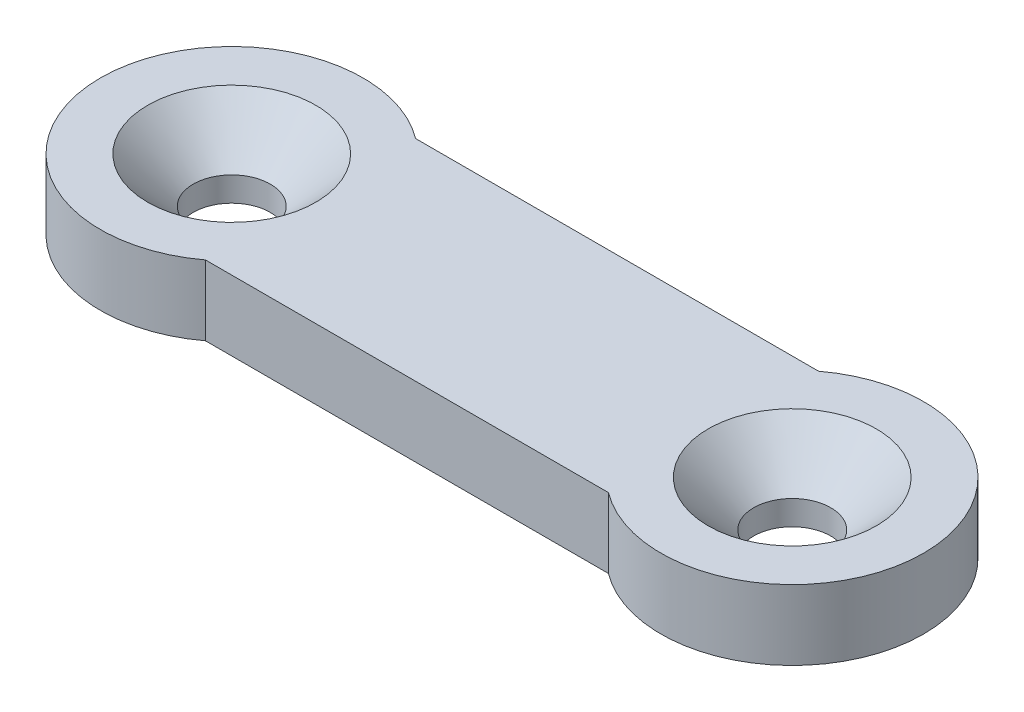
ISO-10303-21;
HEADER;
FILE_DESCRIPTION(('STEP AP214'),'2;1');
FILE_NAME('part.step','',(''),(''),'','','');
FILE_SCHEMA(('AUTOMOTIVE_DESIGN { 1 0 10303 214 1 1 1 1 }'));
ENDSEC;
DATA;
#1=APPLICATION_CONTEXT('core data for automotive mechanical design processes');
#2=APPLICATION_PROTOCOL_DEFINITION('international standard','automotive_design',2000,#1);
#3=PRODUCT_CONTEXT('',#1,'mechanical');
#4=PRODUCT('Part','Part','',(#3));
#5=PRODUCT_RELATED_PRODUCT_CATEGORY('part','',(#4));
#6=PRODUCT_DEFINITION_FORMATION('','',#4);
#7=PRODUCT_DEFINITION_CONTEXT('part definition',#1,'design');
#8=PRODUCT_DEFINITION('design','',#6,#7);
#9=PRODUCT_DEFINITION_SHAPE('','',#8);
#10=(LENGTH_UNIT() NAMED_UNIT(*) SI_UNIT(.MILLI.,.METRE.));
#11=(NAMED_UNIT(*) PLANE_ANGLE_UNIT() SI_UNIT($,.RADIAN.));
#12=(NAMED_UNIT(*) SI_UNIT($,.STERADIAN.) SOLID_ANGLE_UNIT());
#13=UNCERTAINTY_MEASURE_WITH_UNIT(LENGTH_MEASURE(1.E-05),#10,'distance_accuracy_value','');
#14=(GEOMETRIC_REPRESENTATION_CONTEXT(3) GLOBAL_UNCERTAINTY_ASSIGNED_CONTEXT((#13)) GLOBAL_UNIT_ASSIGNED_CONTEXT((#10,
#11,#12)) REPRESENTATION_CONTEXT('',''));
#15=CARTESIAN_POINT('',(0.,0.,0.));
#16=DIRECTION('',(0.,0.,1.));
#17=DIRECTION('',(1.,0.,0.));
#18=AXIS2_PLACEMENT_3D('',#15,#16,#17);
#19=CARTESIAN_POINT('',(-8.,2.,0.));
#20=DIRECTION('',(0.,1.,0.));
#21=DIRECTION('',(0.,0.,1.));
#22=AXIS2_PLACEMENT_3D('',#19,#20,#21);
#23=PLANE('',#22);
#24=CARTESIAN_POINT('',(8.,2.,0.));
#25=DIRECTION('',(0.,1.,0.));
#26=DIRECTION('',(0.,0.,1.));
#27=AXIS2_PLACEMENT_3D('',#24,#25,#26);
#28=CIRCLE('',#27,2.40000000000001);
#29=CARTESIAN_POINT('',(8.,2.,2.4));
#30=VERTEX_POINT('',#29);
#31=EDGE_CURVE('E45',#30,#30,#28,.F.);
#32=ORIENTED_EDGE('',*,*,#31,.T.);
#33=EDGE_LOOP('',(#32));
#34=FACE_BOUND('',#33,.T.);
#35=CARTESIAN_POINT('',(-8.,2.,0.));
#36=DIRECTION('',(0.,1.,0.));
#37=DIRECTION('',(0.,0.,1.));
#38=AXIS2_PLACEMENT_3D('',#35,#36,#37);
#39=CIRCLE('',#38,2.40000000000001);
#40=CARTESIAN_POINT('',(-8.,2.,2.40000000000001));
#41=VERTEX_POINT('',#40);
#42=EDGE_CURVE('E123',#41,#41,#39,.F.);
#43=ORIENTED_EDGE('',*,*,#42,.T.);
#44=EDGE_LOOP('',(#43));
#45=FACE_BOUND('',#44,.T.);
#46=DIRECTION('',(1.,0.,0.));
#47=VECTOR('',#46,1.);
#48=CARTESIAN_POINT('',(-8.,2.,3.));
#49=LINE('',#48,#47);
#50=CARTESIAN_POINT('',(-5.75,2.,3.));
#51=VERTEX_POINT('',#50);
#52=CARTESIAN_POINT('',(5.75,2.,3.));
#53=VERTEX_POINT('',#52);
#54=EDGE_CURVE('E87',#51,#53,#49,.T.);
#55=ORIENTED_EDGE('',*,*,#54,.T.);
#56=CARTESIAN_POINT('',(8.,2.,0.));
#57=DIRECTION('',(0.,1.,0.));
#58=DIRECTION('',(0.,0.,1.));
#59=AXIS2_PLACEMENT_3D('',#56,#57,#58);
#60=CIRCLE('',#59,3.75);
#61=CARTESIAN_POINT('',(5.75,2.,-3.));
#62=VERTEX_POINT('',#61);
#63=EDGE_CURVE('E100',#53,#62,#60,.T.);
#64=ORIENTED_EDGE('',*,*,#63,.T.);
#65=DIRECTION('',(-1.,0.,0.));
#66=VECTOR('',#65,1.);
#67=CARTESIAN_POINT('',(-8.,2.,-3.));
#68=LINE('',#67,#66);
#69=CARTESIAN_POINT('',(-5.75,2.,-3.));
#70=VERTEX_POINT('',#69);
#71=EDGE_CURVE('E92',#62,#70,#68,.T.);
#72=ORIENTED_EDGE('',*,*,#71,.T.);
#73=CARTESIAN_POINT('',(-8.,2.,0.));
#74=DIRECTION('',(0.,1.,0.));
#75=DIRECTION('',(0.,0.,1.));
#76=AXIS2_PLACEMENT_3D('',#73,#74,#75);
#77=CIRCLE('',#76,3.75);
#78=EDGE_CURVE('E102',#70,#51,#77,.T.);
#79=ORIENTED_EDGE('',*,*,#78,.T.);
#80=EDGE_LOOP('',(#55,#64,#72,#79));
#81=FACE_BOUND('',#80,.T.);
#82=ADVANCED_FACE('F36',(#34,#45,#81),#23,.T.);
#83=CARTESIAN_POINT('',(-8.,0.,0.));
#84=DIRECTION('',(0.,1.,0.));
#85=DIRECTION('',(0.,0.,1.));
#86=AXIS2_PLACEMENT_3D('',#83,#84,#85);
#87=PLANE('',#86);
#88=DIRECTION('',(-1.,0.,0.));
#89=VECTOR('',#88,1.);
#90=CARTESIAN_POINT('',(-8.,0.,-3.));
#91=LINE('',#90,#89);
#92=CARTESIAN_POINT('',(5.75,0.,-3.));
#93=VERTEX_POINT('',#92);
#94=CARTESIAN_POINT('',(-5.75,0.,-3.));
#95=VERTEX_POINT('',#94);
#96=EDGE_CURVE('E76',#93,#95,#91,.T.);
#97=ORIENTED_EDGE('',*,*,#96,.F.);
#98=CARTESIAN_POINT('',(8.,0.,0.));
#99=DIRECTION('',(0.,1.,0.));
#100=DIRECTION('',(0.,0.,1.));
#101=AXIS2_PLACEMENT_3D('',#98,#99,#100);
#102=CIRCLE('',#101,3.75);
#103=CARTESIAN_POINT('',(5.75,0.,3.));
#104=VERTEX_POINT('',#103);
#105=EDGE_CURVE('E81',#93,#104,#102,.F.);
#106=ORIENTED_EDGE('',*,*,#105,.T.);
#107=DIRECTION('',(1.,0.,0.));
#108=VECTOR('',#107,1.);
#109=CARTESIAN_POINT('',(-8.,0.,3.));
#110=LINE('',#109,#108);
#111=CARTESIAN_POINT('',(-5.75,0.,3.));
#112=VERTEX_POINT('',#111);
#113=EDGE_CURVE('E52',#112,#104,#110,.T.);
#114=ORIENTED_EDGE('',*,*,#113,.F.);
#115=CARTESIAN_POINT('',(-8.,0.,0.));
#116=DIRECTION('',(0.,1.,0.));
#117=DIRECTION('',(0.,0.,1.));
#118=AXIS2_PLACEMENT_3D('',#115,#116,#117);
#119=CIRCLE('',#118,3.75);
#120=EDGE_CURVE('E83',#112,#95,#119,.F.);
#121=ORIENTED_EDGE('',*,*,#120,.T.);
#122=EDGE_LOOP('',(#97,#106,#114,#121));
#123=FACE_BOUND('',#122,.T.);
#124=CARTESIAN_POINT('',(-8.,0.,0.));
#125=DIRECTION('',(0.,1.,0.));
#126=DIRECTION('',(0.,0.,1.));
#127=AXIS2_PLACEMENT_3D('',#124,#125,#126);
#128=CIRCLE('',#127,1.1);
#129=CARTESIAN_POINT('',(-8.,0.,1.1));
#130=VERTEX_POINT('',#129);
#131=EDGE_CURVE('E114',#130,#130,#128,.T.);
#132=ORIENTED_EDGE('',*,*,#131,.T.);
#133=EDGE_LOOP('',(#132));
#134=FACE_BOUND('',#133,.T.);
#135=CARTESIAN_POINT('',(8.,0.,0.));
#136=DIRECTION('',(0.,1.,0.));
#137=DIRECTION('',(0.,0.,1.));
#138=AXIS2_PLACEMENT_3D('',#135,#136,#137);
#139=CIRCLE('',#138,1.1);
#140=CARTESIAN_POINT('',(8.,0.,1.1));
#141=VERTEX_POINT('',#140);
#142=EDGE_CURVE('E111',#141,#141,#139,.T.);
#143=ORIENTED_EDGE('',*,*,#142,.T.);
#144=EDGE_LOOP('',(#143));
#145=FACE_BOUND('',#144,.T.);
#146=ADVANCED_FACE('F78',(#123,#134,#145),#87,.F.);
#147=CARTESIAN_POINT('',(-8.,2.,3.));
#148=DIRECTION('',(0.,0.,-1.));
#149=DIRECTION('',(-1.,0.,0.));
#150=AXIS2_PLACEMENT_3D('',#147,#148,#149);
#151=PLANE('',#150);
#152=ORIENTED_EDGE('',*,*,#113,.T.);
#153=DIRECTION('',(0.,1.,0.));
#154=VECTOR('',#153,1.);
#155=CARTESIAN_POINT('',(5.75,-10.6066017177982,3.));
#156=LINE('',#155,#154);
#157=EDGE_CURVE('E56',#104,#53,#156,.T.);
#158=ORIENTED_EDGE('',*,*,#157,.T.);
#159=ORIENTED_EDGE('',*,*,#54,.F.);
#160=DIRECTION('',(0.,1.,0.));
#161=VECTOR('',#160,1.);
#162=CARTESIAN_POINT('',(-5.75,-10.6066017177982,3.));
#163=LINE('',#162,#161);
#164=EDGE_CURVE('E107',#51,#112,#163,.F.);
#165=ORIENTED_EDGE('',*,*,#164,.T.);
#166=EDGE_LOOP('',(#152,#158,#159,#165));
#167=FACE_BOUND('',#166,.T.);
#168=ADVANCED_FACE('F144',(#167),#151,.F.);
#169=CARTESIAN_POINT('',(-8.,2.,-3.));
#170=DIRECTION('',(0.,0.,1.));
#171=DIRECTION('',(1.,0.,0.));
#172=AXIS2_PLACEMENT_3D('',#169,#170,#171);
#173=PLANE('',#172);
#174=ORIENTED_EDGE('',*,*,#71,.F.);
#175=DIRECTION('',(0.,1.,0.));
#176=VECTOR('',#175,1.);
#177=CARTESIAN_POINT('',(5.75,-10.6066017177982,-3.));
#178=LINE('',#177,#176);
#179=EDGE_CURVE('E90',#62,#93,#178,.F.);
#180=ORIENTED_EDGE('',*,*,#179,.T.);
#181=ORIENTED_EDGE('',*,*,#96,.T.);
#182=DIRECTION('',(0.,1.,0.));
#183=VECTOR('',#182,1.);
#184=CARTESIAN_POINT('',(-5.75,-10.6066017177982,-3.));
#185=LINE('',#184,#183);
#186=EDGE_CURVE('E97',#95,#70,#185,.T.);
#187=ORIENTED_EDGE('',*,*,#186,.T.);
#188=EDGE_LOOP('',(#174,#180,#181,#187));
#189=FACE_BOUND('',#188,.T.);
#190=ADVANCED_FACE('F91',(#189),#173,.F.);
#191=CARTESIAN_POINT('',(-8.,2.,0.));
#192=DIRECTION('',(0.,-1.,0.));
#193=DIRECTION('',(0.,0.,-1.));
#194=AXIS2_PLACEMENT_3D('',#191,#192,#193);
#195=CYLINDRICAL_SURFACE('',#194,1.1);
#196=CARTESIAN_POINT('',(-8.,0.699999999999998,0.));
#197=DIRECTION('',(0.,1.,0.));
#198=DIRECTION('',(0.,0.,1.));
#199=AXIS2_PLACEMENT_3D('',#196,#197,#198);
#200=CIRCLE('',#199,1.1);
#201=CARTESIAN_POINT('',(-8.,0.699999999999998,1.1));
#202=VERTEX_POINT('',#201);
#203=EDGE_CURVE('E11',#202,#202,#200,.T.);
#204=ORIENTED_EDGE('',*,*,#203,.T.);
#205=EDGE_LOOP('',(#204));
#206=FACE_BOUND('',#205,.T.);
#207=ORIENTED_EDGE('',*,*,#131,.F.);
#208=EDGE_LOOP('',(#207));
#209=FACE_BOUND('',#208,.T.);
#210=ADVANCED_FACE('F139',(#206,#209),#195,.F.);
#211=CARTESIAN_POINT('',(8.,2.,0.));
#212=DIRECTION('',(0.,-1.,0.));
#213=DIRECTION('',(0.,0.,-1.));
#214=AXIS2_PLACEMENT_3D('',#211,#212,#213);
#215=CYLINDRICAL_SURFACE('',#214,1.1);
#216=CARTESIAN_POINT('',(8.,0.699999999999998,0.));
#217=DIRECTION('',(0.,1.,0.));
#218=DIRECTION('',(0.,0.,1.));
#219=AXIS2_PLACEMENT_3D('',#216,#217,#218);
#220=CIRCLE('',#219,1.1);
#221=CARTESIAN_POINT('',(8.,0.699999999999998,1.1));
#222=VERTEX_POINT('',#221);
#223=EDGE_CURVE('E96',#222,#222,#220,.T.);
#224=ORIENTED_EDGE('',*,*,#223,.T.);
#225=EDGE_LOOP('',(#224));
#226=FACE_BOUND('',#225,.T.);
#227=ORIENTED_EDGE('',*,*,#142,.F.);
#228=EDGE_LOOP('',(#227));
#229=FACE_BOUND('',#228,.T.);
#230=ADVANCED_FACE('F135',(#226,#229),#215,.F.);
#231=CARTESIAN_POINT('',(-8.,-10.6066017177982,0.));
#232=DIRECTION('',(0.,1.,0.));
#233=DIRECTION('',(0.,0.,1.));
#234=AXIS2_PLACEMENT_3D('',#231,#232,#233);
#235=CYLINDRICAL_SURFACE('',#234,3.75);
#236=ORIENTED_EDGE('',*,*,#164,.F.);
#237=ORIENTED_EDGE('',*,*,#78,.F.);
#238=ORIENTED_EDGE('',*,*,#186,.F.);
#239=ORIENTED_EDGE('',*,*,#120,.F.);
#240=EDGE_LOOP('',(#236,#237,#238,#239));
#241=FACE_BOUND('',#240,.T.);
#242=ADVANCED_FACE('F138',(#241),#235,.T.);
#243=CARTESIAN_POINT('',(8.,-10.6066017177982,0.));
#244=DIRECTION('',(0.,1.,0.));
#245=DIRECTION('',(0.,0.,1.));
#246=AXIS2_PLACEMENT_3D('',#243,#244,#245);
#247=CYLINDRICAL_SURFACE('',#246,3.75);
#248=ORIENTED_EDGE('',*,*,#157,.F.);
#249=ORIENTED_EDGE('',*,*,#105,.F.);
#250=ORIENTED_EDGE('',*,*,#179,.F.);
#251=ORIENTED_EDGE('',*,*,#63,.F.);
#252=EDGE_LOOP('',(#248,#249,#250,#251));
#253=FACE_BOUND('',#252,.T.);
#254=ADVANCED_FACE('F99',(#253),#247,.T.);
#255=CARTESIAN_POINT('',(8.,0.699999999999998,0.));
#256=DIRECTION('',(0.,1.,0.));
#257=DIRECTION('',(0.,0.,1.));
#258=AXIS2_PLACEMENT_3D('',#255,#256,#257);
#259=CONICAL_SURFACE('',#258,1.1,0.78539816339745);
#260=ORIENTED_EDGE('',*,*,#31,.F.);
#261=EDGE_LOOP('',(#260));
#262=FACE_BOUND('',#261,.T.);
#263=ORIENTED_EDGE('',*,*,#223,.F.);
#264=EDGE_LOOP('',(#263));
#265=FACE_BOUND('',#264,.T.);
#266=ADVANCED_FACE('F130',(#262,#265),#259,.F.);
#267=CARTESIAN_POINT('',(-8.,0.699999999999998,0.));
#268=DIRECTION('',(0.,1.,0.));
#269=DIRECTION('',(0.,0.,1.));
#270=AXIS2_PLACEMENT_3D('',#267,#268,#269);
#271=CONICAL_SURFACE('',#270,1.1,0.78539816339745);
#272=ORIENTED_EDGE('',*,*,#42,.F.);
#273=EDGE_LOOP('',(#272));
#274=FACE_BOUND('',#273,.T.);
#275=ORIENTED_EDGE('',*,*,#203,.F.);
#276=EDGE_LOOP('',(#275));
#277=FACE_BOUND('',#276,.T.);
#278=ADVANCED_FACE('F39',(#274,#277),#271,.F.);
#279=CLOSED_SHELL('',(#82,#146,#168,#190,#210,#230,#242,#254,#266,#278));
#280=MANIFOLD_SOLID_BREP('B2',#279);
#281=ADVANCED_BREP_SHAPE_REPRESENTATION('',(#18,#280),#14);
#282=SHAPE_DEFINITION_REPRESENTATION(#9,#281);
ENDSEC;
END-ISO-10303-21;
